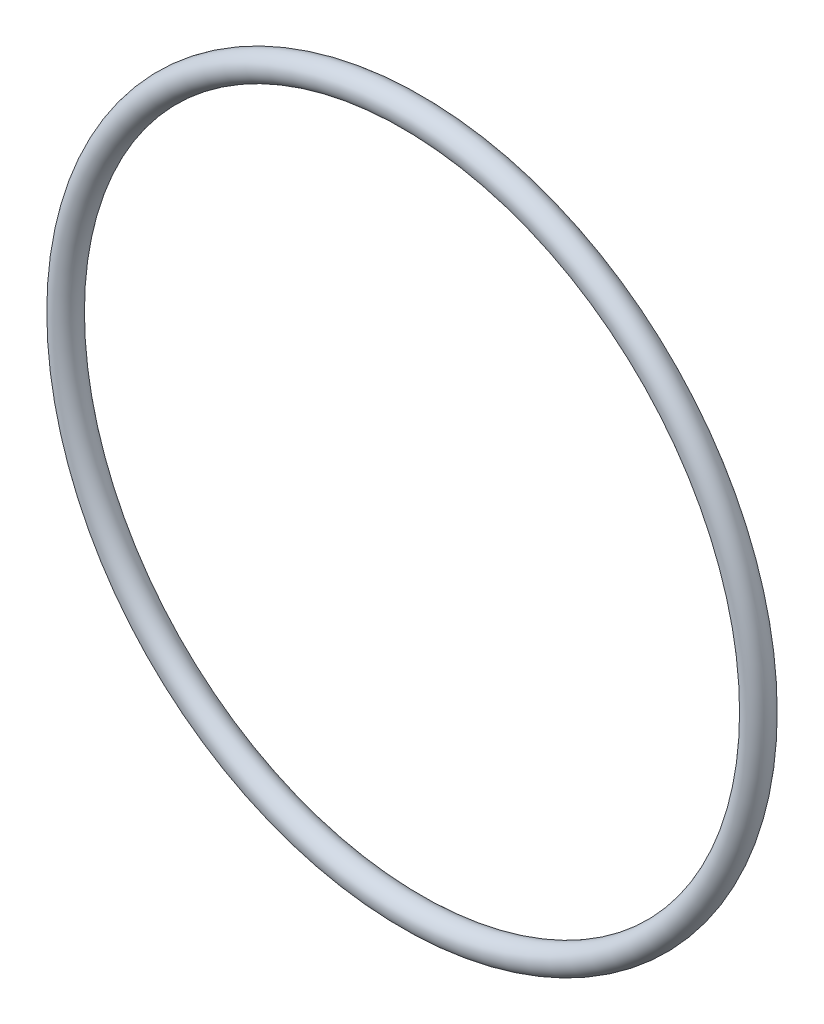
ISO-10303-21;
HEADER;
FILE_DESCRIPTION(('STEP AP214'),'2;1');
FILE_NAME('part.step','',(''),(''),'','','');
FILE_SCHEMA(('AUTOMOTIVE_DESIGN { 1 0 10303 214 1 1 1 1 }'));
ENDSEC;
DATA;
#1=APPLICATION_CONTEXT('core data for automotive mechanical design processes');
#2=APPLICATION_PROTOCOL_DEFINITION('international standard','automotive_design',2000,#1);
#3=PRODUCT_CONTEXT('',#1,'mechanical');
#4=PRODUCT('Part','Part','',(#3));
#5=PRODUCT_RELATED_PRODUCT_CATEGORY('part','',(#4));
#6=PRODUCT_DEFINITION_FORMATION('','',#4);
#7=PRODUCT_DEFINITION_CONTEXT('part definition',#1,'design');
#8=PRODUCT_DEFINITION('design','',#6,#7);
#9=PRODUCT_DEFINITION_SHAPE('','',#8);
#10=(LENGTH_UNIT() NAMED_UNIT(*) SI_UNIT(.MILLI.,.METRE.));
#11=(NAMED_UNIT(*) PLANE_ANGLE_UNIT() SI_UNIT($,.RADIAN.));
#12=(NAMED_UNIT(*) SI_UNIT($,.STERADIAN.) SOLID_ANGLE_UNIT());
#13=UNCERTAINTY_MEASURE_WITH_UNIT(LENGTH_MEASURE(1.E-05),#10,'distance_accuracy_value','');
#14=(GEOMETRIC_REPRESENTATION_CONTEXT(3) GLOBAL_UNCERTAINTY_ASSIGNED_CONTEXT((#13)) GLOBAL_UNIT_ASSIGNED_CONTEXT((#10,
#11,#12)) REPRESENTATION_CONTEXT('',''));
#15=CARTESIAN_POINT('',(0.,0.,0.));
#16=DIRECTION('',(0.,0.,1.));
#17=DIRECTION('',(1.,0.,0.));
#18=AXIS2_PLACEMENT_3D('',#15,#16,#17);
#19=CARTESIAN_POINT('',(0.,0.,0.));
#20=DIRECTION('',(0.,0.,-1.));
#21=DIRECTION('',(-1.,0.,0.));
#22=AXIS2_PLACEMENT_3D('',#19,#20,#21);
#23=TOROIDAL_SURFACE('',#22,65.,2.5);
#24=CARTESIAN_POINT('',(-67.5,0.,0.));
#25=VERTEX_POINT('',#24);
#26=VERTEX_LOOP('',#25);
#27=FACE_BOUND('',#26,.T.);
#28=ADVANCED_FACE('F30',(#27),#23,.T.);
#29=CLOSED_SHELL('',(#28));
#30=MANIFOLD_SOLID_BREP('B2',#29);
#31=ADVANCED_BREP_SHAPE_REPRESENTATION('',(#18,#30),#14);
#32=SHAPE_DEFINITION_REPRESENTATION(#9,#31);
ENDSEC;
END-ISO-10303-21;
